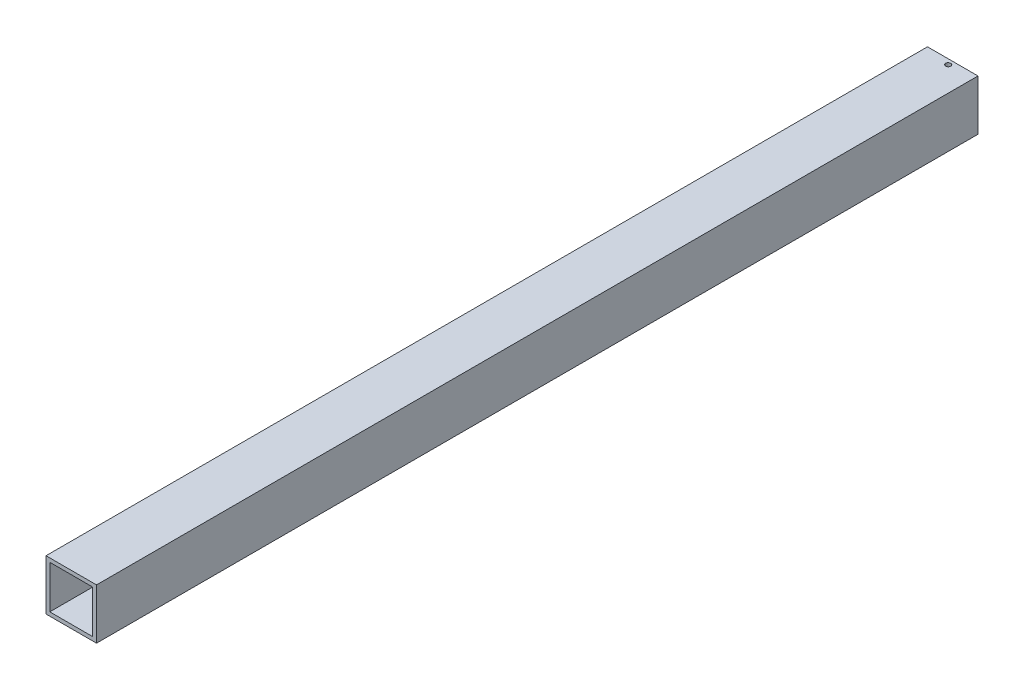
ISO-10303-21;
HEADER;
FILE_DESCRIPTION(('STEP AP214'),'2;1');
FILE_NAME('part.step','',(''),(''),'','','');
FILE_SCHEMA(('AUTOMOTIVE_DESIGN { 1 0 10303 214 1 1 1 1 }'));
ENDSEC;
DATA;
#1=APPLICATION_CONTEXT('core data for automotive mechanical design processes');
#2=APPLICATION_PROTOCOL_DEFINITION('international standard','automotive_design',2000,#1);
#3=PRODUCT_CONTEXT('',#1,'mechanical');
#4=PRODUCT('Part','Part','',(#3));
#5=PRODUCT_RELATED_PRODUCT_CATEGORY('part','',(#4));
#6=PRODUCT_DEFINITION_FORMATION('','',#4);
#7=PRODUCT_DEFINITION_CONTEXT('part definition',#1,'design');
#8=PRODUCT_DEFINITION('design','',#6,#7);
#9=PRODUCT_DEFINITION_SHAPE('','',#8);
#10=(LENGTH_UNIT() NAMED_UNIT(*) SI_UNIT(.MILLI.,.METRE.));
#11=(NAMED_UNIT(*) PLANE_ANGLE_UNIT() SI_UNIT($,.RADIAN.));
#12=(NAMED_UNIT(*) SI_UNIT($,.STERADIAN.) SOLID_ANGLE_UNIT());
#13=UNCERTAINTY_MEASURE_WITH_UNIT(LENGTH_MEASURE(1.E-05),#10,'distance_accuracy_value','');
#14=(GEOMETRIC_REPRESENTATION_CONTEXT(3) GLOBAL_UNCERTAINTY_ASSIGNED_CONTEXT((#13)) GLOBAL_UNIT_ASSIGNED_CONTEXT((#10,
#11,#12)) REPRESENTATION_CONTEXT('',''));
#15=CARTESIAN_POINT('',(0.,0.,0.));
#16=DIRECTION('',(0.,0.,1.));
#17=DIRECTION('',(1.,0.,0.));
#18=AXIS2_PLACEMENT_3D('',#15,#16,#17);
#19=CARTESIAN_POINT('',(-10.422988866238,18.5,377.284271247462));
#20=DIRECTION('',(-1.,0.,0.));
#21=DIRECTION('',(0.,-1.,0.));
#22=AXIS2_PLACEMENT_3D('',#19,#20,#21);
#23=PLANE('',#22);
#24=DIRECTION('',(0.,1.,0.));
#25=VECTOR('',#24,1.);
#26=CARTESIAN_POINT('',(-10.422988866238,18.5,349.));
#27=LINE('',#26,#25);
#28=CARTESIAN_POINT('',(-10.422988866238,-1.5,349.));
#29=VERTEX_POINT('',#28);
#30=CARTESIAN_POINT('',(-10.422988866238,18.5,349.));
#31=VERTEX_POINT('',#30);
#32=EDGE_CURVE('E11',#29,#31,#27,.T.);
#33=ORIENTED_EDGE('',*,*,#32,.F.);
#34=DIRECTION('',(0.,0.,-1.));
#35=VECTOR('',#34,1.);
#36=CARTESIAN_POINT('',(-10.422988866238,-1.5,377.284271247462));
#37=LINE('',#36,#35);
#38=CARTESIAN_POINT('',(-10.422988866238,-1.5,0.));
#39=VERTEX_POINT('',#38);
#40=EDGE_CURVE('E151',#29,#39,#37,.T.);
#41=ORIENTED_EDGE('',*,*,#40,.T.);
#42=DIRECTION('',(0.,1.,0.));
#43=VECTOR('',#42,1.);
#44=CARTESIAN_POINT('',(-10.422988866238,18.5,0.));
#45=LINE('',#44,#43);
#46=CARTESIAN_POINT('',(-10.422988866238,18.5,0.));
#47=VERTEX_POINT('',#46);
#48=EDGE_CURVE('E146',#39,#47,#45,.T.);
#49=ORIENTED_EDGE('',*,*,#48,.T.);
#50=DIRECTION('',(0.,0.,-1.));
#51=VECTOR('',#50,1.);
#52=CARTESIAN_POINT('',(-10.422988866238,18.5,377.284271247462));
#53=LINE('',#52,#51);
#54=EDGE_CURVE('E149',#31,#47,#53,.T.);
#55=ORIENTED_EDGE('',*,*,#54,.F.);
#56=EDGE_LOOP('',(#33,#41,#49,#55));
#57=FACE_BOUND('',#56,.T.);
#58=ADVANCED_FACE('F32',(#57),#23,.F.);
#59=CARTESIAN_POINT('',(-30.422988866238,-1.5,377.284271247462));
#60=DIRECTION('',(0.,1.,0.));
#61=DIRECTION('',(0.,0.,1.));
#62=AXIS2_PLACEMENT_3D('',#59,#60,#61);
#63=PLANE('',#62);
#64=CARTESIAN_POINT('',(-20.1716169837596,-1.5,2.04638998269502));
#65=DIRECTION('',(0.,1.,0.));
#66=DIRECTION('',(-1.,0.,0.));
#67=AXIS2_PLACEMENT_3D('',#64,#65,#66);
#68=CIRCLE('',#67,1.);
#69=CARTESIAN_POINT('',(-21.1716169837596,-1.50000000000001,2.04638998269502));
#70=VERTEX_POINT('',#69);
#71=EDGE_CURVE('E170',#70,#70,#68,.T.);
#72=ORIENTED_EDGE('',*,*,#71,.T.);
#73=EDGE_LOOP('',(#72));
#74=FACE_BOUND('',#73,.T.);
#75=DIRECTION('',(1.,0.,0.));
#76=VECTOR('',#75,1.);
#77=CARTESIAN_POINT('',(-30.4229888662381,-1.5,349.));
#78=LINE('',#77,#76);
#79=CARTESIAN_POINT('',(-30.422988866238,-1.49999999999997,349.));
#80=VERTEX_POINT('',#79);
#81=EDGE_CURVE('E71',#80,#29,#78,.T.);
#82=ORIENTED_EDGE('',*,*,#81,.F.);
#83=DIRECTION('',(0.,0.,-1.));
#84=VECTOR('',#83,1.);
#85=CARTESIAN_POINT('',(-30.422988866238,-1.5,377.284271247462));
#86=LINE('',#85,#84);
#87=CARTESIAN_POINT('',(-30.422988866238,-1.5,0.));
#88=VERTEX_POINT('',#87);
#89=EDGE_CURVE('E153',#80,#88,#86,.T.);
#90=ORIENTED_EDGE('',*,*,#89,.T.);
#91=DIRECTION('',(1.,0.,0.));
#92=VECTOR('',#91,1.);
#93=CARTESIAN_POINT('',(-30.422988866238,-1.5,0.));
#94=LINE('',#93,#92);
#95=EDGE_CURVE('E143',#88,#39,#94,.T.);
#96=ORIENTED_EDGE('',*,*,#95,.T.);
#97=ORIENTED_EDGE('',*,*,#40,.F.);
#98=EDGE_LOOP('',(#82,#90,#96,#97));
#99=FACE_BOUND('',#98,.T.);
#100=ADVANCED_FACE('F193',(#74,#99),#63,.F.);
#101=CARTESIAN_POINT('',(-30.422988866238,18.5,377.284271247462));
#102=DIRECTION('',(1.,0.,0.));
#103=DIRECTION('',(0.,1.,0.));
#104=AXIS2_PLACEMENT_3D('',#101,#102,#103);
#105=PLANE('',#104);
#106=DIRECTION('',(0.,-1.,0.));
#107=VECTOR('',#106,1.);
#108=CARTESIAN_POINT('',(-30.422988866238,18.5,349.));
#109=LINE('',#108,#107);
#110=CARTESIAN_POINT('',(-30.422988866238,18.5,349.));
#111=VERTEX_POINT('',#110);
#112=EDGE_CURVE('E161',#111,#80,#109,.T.);
#113=ORIENTED_EDGE('',*,*,#112,.F.);
#114=DIRECTION('',(0.,0.,-1.));
#115=VECTOR('',#114,1.);
#116=CARTESIAN_POINT('',(-30.422988866238,18.5,377.284271247462));
#117=LINE('',#116,#115);
#118=CARTESIAN_POINT('',(-30.422988866238,18.5,0.));
#119=VERTEX_POINT('',#118);
#120=EDGE_CURVE('E155',#111,#119,#117,.T.);
#121=ORIENTED_EDGE('',*,*,#120,.T.);
#122=DIRECTION('',(0.,-1.,0.));
#123=VECTOR('',#122,1.);
#124=CARTESIAN_POINT('',(-30.422988866238,18.5,0.));
#125=LINE('',#124,#123);
#126=EDGE_CURVE('E140',#119,#88,#125,.T.);
#127=ORIENTED_EDGE('',*,*,#126,.T.);
#128=ORIENTED_EDGE('',*,*,#89,.F.);
#129=EDGE_LOOP('',(#113,#121,#127,#128));
#130=FACE_BOUND('',#129,.T.);
#131=ADVANCED_FACE('F199',(#130),#105,.F.);
#132=CARTESIAN_POINT('',(-30.422988866238,18.5,377.284271247462));
#133=DIRECTION('',(0.,-1.,0.));
#134=DIRECTION('',(1.,0.,0.));
#135=AXIS2_PLACEMENT_3D('',#132,#133,#134);
#136=PLANE('',#135);
#137=CARTESIAN_POINT('',(-20.1716169837596,18.5,2.04638998269502));
#138=DIRECTION('',(0.,1.,0.));
#139=DIRECTION('',(-1.,0.,0.));
#140=AXIS2_PLACEMENT_3D('',#137,#138,#139);
#141=CIRCLE('',#140,1.);
#142=CARTESIAN_POINT('',(-21.1716169837596,18.5,2.04638998269502));
#143=VERTEX_POINT('',#142);
#144=EDGE_CURVE('E167',#143,#143,#141,.T.);
#145=ORIENTED_EDGE('',*,*,#144,.F.);
#146=EDGE_LOOP('',(#145));
#147=FACE_BOUND('',#146,.T.);
#148=DIRECTION('',(-1.,0.,0.));
#149=VECTOR('',#148,1.);
#150=CARTESIAN_POINT('',(-30.4229888662381,18.5,349.));
#151=LINE('',#150,#149);
#152=EDGE_CURVE('E162',#31,#111,#151,.T.);
#153=ORIENTED_EDGE('',*,*,#152,.F.);
#154=ORIENTED_EDGE('',*,*,#54,.T.);
#155=DIRECTION('',(-1.,0.,0.));
#156=VECTOR('',#155,1.);
#157=CARTESIAN_POINT('',(-30.422988866238,18.5,0.));
#158=LINE('',#157,#156);
#159=EDGE_CURVE('E109',#47,#119,#158,.T.);
#160=ORIENTED_EDGE('',*,*,#159,.T.);
#161=ORIENTED_EDGE('',*,*,#120,.F.);
#162=EDGE_LOOP('',(#153,#154,#160,#161));
#163=FACE_BOUND('',#162,.T.);
#164=ADVANCED_FACE('F34',(#147,#163),#136,.F.);
#165=CARTESIAN_POINT('',(0.,0.,0.));
#166=DIRECTION('',(0.,0.,-1.));
#167=DIRECTION('',(-1.,0.,0.));
#168=AXIS2_PLACEMENT_3D('',#165,#166,#167);
#169=PLANE('',#168);
#170=ORIENTED_EDGE('',*,*,#159,.F.);
#171=ORIENTED_EDGE('',*,*,#48,.F.);
#172=ORIENTED_EDGE('',*,*,#95,.F.);
#173=ORIENTED_EDGE('',*,*,#126,.F.);
#174=EDGE_LOOP('',(#170,#171,#172,#173));
#175=FACE_BOUND('',#174,.T.);
#176=DIRECTION('',(-1.,0.,0.));
#177=VECTOR('',#176,1.);
#178=CARTESIAN_POINT('',(-28.922988866238,17.,0.));
#179=LINE('',#178,#177);
#180=CARTESIAN_POINT('',(-11.922988866238,17.,0.));
#181=VERTEX_POINT('',#180);
#182=CARTESIAN_POINT('',(-28.922988866238,17.,0.));
#183=VERTEX_POINT('',#182);
#184=EDGE_CURVE('E123',#181,#183,#179,.T.);
#185=ORIENTED_EDGE('',*,*,#184,.T.);
#186=DIRECTION('',(0.,-1.,0.));
#187=VECTOR('',#186,1.);
#188=CARTESIAN_POINT('',(-28.922988866238,17.,0.));
#189=LINE('',#188,#187);
#190=CARTESIAN_POINT('',(-28.922988866238,0.,0.));
#191=VERTEX_POINT('',#190);
#192=EDGE_CURVE('E106',#183,#191,#189,.T.);
#193=ORIENTED_EDGE('',*,*,#192,.T.);
#194=DIRECTION('',(1.,0.,0.));
#195=VECTOR('',#194,1.);
#196=CARTESIAN_POINT('',(-28.922988866238,0.,0.));
#197=LINE('',#196,#195);
#198=CARTESIAN_POINT('',(-11.922988866238,0.,0.));
#199=VERTEX_POINT('',#198);
#200=EDGE_CURVE('E113',#191,#199,#197,.T.);
#201=ORIENTED_EDGE('',*,*,#200,.T.);
#202=DIRECTION('',(0.,1.,0.));
#203=VECTOR('',#202,1.);
#204=CARTESIAN_POINT('',(-11.922988866238,17.,0.));
#205=LINE('',#204,#203);
#206=EDGE_CURVE('E119',#199,#181,#205,.T.);
#207=ORIENTED_EDGE('',*,*,#206,.T.);
#208=EDGE_LOOP('',(#185,#193,#201,#207));
#209=FACE_BOUND('',#208,.T.);
#210=ADVANCED_FACE('F121',(#175,#209),#169,.T.);
#211=CARTESIAN_POINT('',(-28.922988866238,17.,377.284271247462));
#212=DIRECTION('',(0.,-1.,0.));
#213=DIRECTION('',(0.,0.,-1.));
#214=AXIS2_PLACEMENT_3D('',#211,#212,#213);
#215=PLANE('',#214);
#216=CARTESIAN_POINT('',(-20.1716169837596,17.,2.04638998269502));
#217=DIRECTION('',(0.,-1.,0.));
#218=DIRECTION('',(0.,0.,-1.));
#219=AXIS2_PLACEMENT_3D('',#216,#217,#218);
#220=CIRCLE('',#219,1.);
#221=CARTESIAN_POINT('',(-20.1716169837596,17.,1.04638998269502));
#222=VERTEX_POINT('',#221);
#223=EDGE_CURVE('E124',#222,#222,#220,.T.);
#224=ORIENTED_EDGE('',*,*,#223,.F.);
#225=EDGE_LOOP('',(#224));
#226=FACE_BOUND('',#225,.T.);
#227=DIRECTION('',(0.,0.,-1.));
#228=VECTOR('',#227,1.);
#229=CARTESIAN_POINT('',(-11.922988866238,17.,377.284271247462));
#230=LINE('',#229,#228);
#231=CARTESIAN_POINT('',(-11.922988866238,17.,349.));
#232=VERTEX_POINT('',#231);
#233=EDGE_CURVE('E135',#232,#181,#230,.T.);
#234=ORIENTED_EDGE('',*,*,#233,.F.);
#235=DIRECTION('',(-1.,0.,0.));
#236=VECTOR('',#235,1.);
#237=CARTESIAN_POINT('',(-28.9229888662381,17.,349.));
#238=LINE('',#237,#236);
#239=CARTESIAN_POINT('',(-28.922988866238,17.,349.));
#240=VERTEX_POINT('',#239);
#241=EDGE_CURVE('E157',#232,#240,#238,.T.);
#242=ORIENTED_EDGE('',*,*,#241,.T.);
#243=DIRECTION('',(0.,0.,-1.));
#244=VECTOR('',#243,1.);
#245=CARTESIAN_POINT('',(-28.922988866238,17.,377.284271247462));
#246=LINE('',#245,#244);
#247=EDGE_CURVE('E133',#240,#183,#246,.T.);
#248=ORIENTED_EDGE('',*,*,#247,.T.);
#249=ORIENTED_EDGE('',*,*,#184,.F.);
#250=EDGE_LOOP('',(#234,#242,#248,#249));
#251=FACE_BOUND('',#250,.T.);
#252=ADVANCED_FACE('F189',(#226,#251),#215,.T.);
#253=CARTESIAN_POINT('',(-11.922988866238,17.,377.284271247462));
#254=DIRECTION('',(-1.,0.,0.));
#255=DIRECTION('',(0.,-1.,0.));
#256=AXIS2_PLACEMENT_3D('',#253,#254,#255);
#257=PLANE('',#256);
#258=DIRECTION('',(0.,0.,-1.));
#259=VECTOR('',#258,1.);
#260=CARTESIAN_POINT('',(-11.922988866238,0.,377.284271247462));
#261=LINE('',#260,#259);
#262=CARTESIAN_POINT('',(-11.922988866238,0.,349.));
#263=VERTEX_POINT('',#262);
#264=EDGE_CURVE('E110',#263,#199,#261,.T.);
#265=ORIENTED_EDGE('',*,*,#264,.F.);
#266=DIRECTION('',(0.,1.,0.));
#267=VECTOR('',#266,1.);
#268=CARTESIAN_POINT('',(-11.922988866238,17.,349.));
#269=LINE('',#268,#267);
#270=EDGE_CURVE('E42',#263,#232,#269,.T.);
#271=ORIENTED_EDGE('',*,*,#270,.T.);
#272=ORIENTED_EDGE('',*,*,#233,.T.);
#273=ORIENTED_EDGE('',*,*,#206,.F.);
#274=EDGE_LOOP('',(#265,#271,#272,#273));
#275=FACE_BOUND('',#274,.T.);
#276=ADVANCED_FACE('F181',(#275),#257,.T.);
#277=CARTESIAN_POINT('',(-28.922988866238,0.,377.284271247462));
#278=DIRECTION('',(0.,1.,0.));
#279=DIRECTION('',(0.,0.,1.));
#280=AXIS2_PLACEMENT_3D('',#277,#278,#279);
#281=PLANE('',#280);
#282=CARTESIAN_POINT('',(-20.1716169837596,0.,2.04638998269502));
#283=DIRECTION('',(0.,1.,0.));
#284=DIRECTION('',(0.,0.,1.));
#285=AXIS2_PLACEMENT_3D('',#282,#283,#284);
#286=CIRCLE('',#285,1.);
#287=CARTESIAN_POINT('',(-20.1716169837596,0.,3.04638998269502));
#288=VERTEX_POINT('',#287);
#289=EDGE_CURVE('E36',#288,#288,#286,.T.);
#290=ORIENTED_EDGE('',*,*,#289,.F.);
#291=EDGE_LOOP('',(#290));
#292=FACE_BOUND('',#291,.T.);
#293=DIRECTION('',(0.,0.,-1.));
#294=VECTOR('',#293,1.);
#295=CARTESIAN_POINT('',(-28.922988866238,0.,377.284271247462));
#296=LINE('',#295,#294);
#297=CARTESIAN_POINT('',(-28.922988866238,0.,349.));
#298=VERTEX_POINT('',#297);
#299=EDGE_CURVE('E102',#298,#191,#296,.T.);
#300=ORIENTED_EDGE('',*,*,#299,.F.);
#301=DIRECTION('',(1.,0.,0.));
#302=VECTOR('',#301,1.);
#303=CARTESIAN_POINT('',(-28.9229888662381,0.,349.));
#304=LINE('',#303,#302);
#305=EDGE_CURVE('E51',#298,#263,#304,.T.);
#306=ORIENTED_EDGE('',*,*,#305,.T.);
#307=ORIENTED_EDGE('',*,*,#264,.T.);
#308=ORIENTED_EDGE('',*,*,#200,.F.);
#309=EDGE_LOOP('',(#300,#306,#307,#308));
#310=FACE_BOUND('',#309,.T.);
#311=ADVANCED_FACE('F114',(#292,#310),#281,.T.);
#312=CARTESIAN_POINT('',(-28.922988866238,17.,377.284271247462));
#313=DIRECTION('',(1.,0.,0.));
#314=DIRECTION('',(0.,1.,0.));
#315=AXIS2_PLACEMENT_3D('',#312,#313,#314);
#316=PLANE('',#315);
#317=ORIENTED_EDGE('',*,*,#247,.F.);
#318=DIRECTION('',(0.,-1.,0.));
#319=VECTOR('',#318,1.);
#320=CARTESIAN_POINT('',(-28.922988866238,17.,349.));
#321=LINE('',#320,#319);
#322=EDGE_CURVE('E75',#240,#298,#321,.T.);
#323=ORIENTED_EDGE('',*,*,#322,.T.);
#324=ORIENTED_EDGE('',*,*,#299,.T.);
#325=ORIENTED_EDGE('',*,*,#192,.F.);
#326=EDGE_LOOP('',(#317,#323,#324,#325));
#327=FACE_BOUND('',#326,.T.);
#328=ADVANCED_FACE('F104',(#327),#316,.T.);
#329=CARTESIAN_POINT('',(-10.422988866238,18.5,349.));
#330=DIRECTION('',(0.,0.,1.));
#331=DIRECTION('',(0.,-1.,0.));
#332=AXIS2_PLACEMENT_3D('',#329,#330,#331);
#333=PLANE('',#332);
#334=ORIENTED_EDGE('',*,*,#241,.F.);
#335=ORIENTED_EDGE('',*,*,#270,.F.);
#336=ORIENTED_EDGE('',*,*,#305,.F.);
#337=ORIENTED_EDGE('',*,*,#322,.F.);
#338=EDGE_LOOP('',(#334,#335,#336,#337));
#339=FACE_BOUND('',#338,.T.);
#340=ORIENTED_EDGE('',*,*,#112,.T.);
#341=ORIENTED_EDGE('',*,*,#81,.T.);
#342=ORIENTED_EDGE('',*,*,#32,.T.);
#343=ORIENTED_EDGE('',*,*,#152,.T.);
#344=EDGE_LOOP('',(#340,#341,#342,#343));
#345=FACE_BOUND('',#344,.T.);
#346=ADVANCED_FACE('F187',(#339,#345),#333,.T.);
#347=CARTESIAN_POINT('',(-20.1716169837596,-1.5,2.04638998269502));
#348=DIRECTION('',(0.,1.,0.));
#349=DIRECTION('',(-1.,0.,0.));
#350=AXIS2_PLACEMENT_3D('',#347,#348,#349);
#351=CYLINDRICAL_SURFACE('',#350,1.);
#352=ORIENTED_EDGE('',*,*,#289,.T.);
#353=EDGE_LOOP('',(#352));
#354=FACE_BOUND('',#353,.T.);
#355=ORIENTED_EDGE('',*,*,#71,.F.);
#356=EDGE_LOOP('',(#355));
#357=FACE_BOUND('',#356,.T.);
#358=ADVANCED_FACE('F177',(#354,#357),#351,.F.);
#359=ORIENTED_EDGE('',*,*,#223,.T.);
#360=EDGE_LOOP('',(#359));
#361=FACE_BOUND('',#360,.T.);
#362=ORIENTED_EDGE('',*,*,#144,.T.);
#363=EDGE_LOOP('',(#362));
#364=FACE_BOUND('',#363,.T.);
#365=ADVANCED_FACE('F232',(#361,#364),#351,.F.);
#366=CLOSED_SHELL('',(#58,#100,#131,#164,#210,#252,#276,#311,#328,#346,#358,#365));
#367=MANIFOLD_SOLID_BREP('B2',#366);
#368=ADVANCED_BREP_SHAPE_REPRESENTATION('',(#18,#367),#14);
#369=SHAPE_DEFINITION_REPRESENTATION(#9,#368);
ENDSEC;
END-ISO-10303-21;
